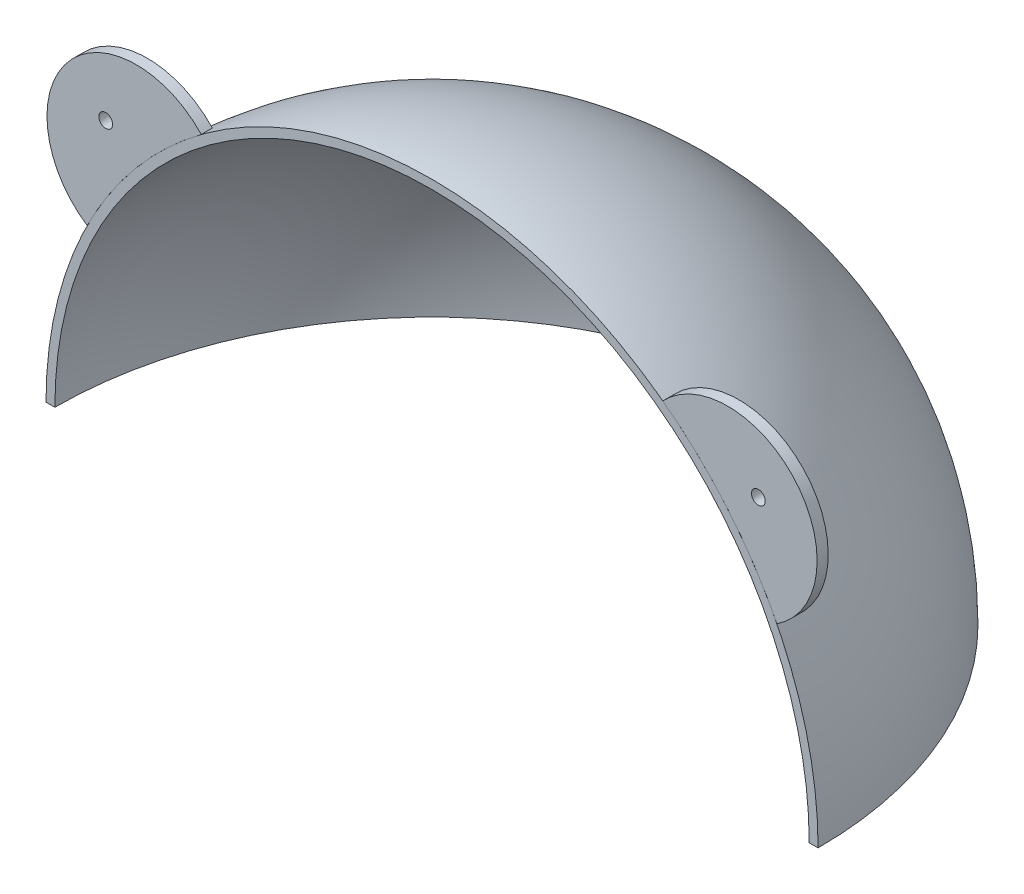
ISO-10303-21;
HEADER;
FILE_DESCRIPTION(('STEP AP214'),'2;1');
FILE_NAME('part.step','',(''),(''),'','','');
FILE_SCHEMA(('AUTOMOTIVE_DESIGN { 1 0 10303 214 1 1 1 1 }'));
ENDSEC;
DATA;
#1=APPLICATION_CONTEXT('core data for automotive mechanical design processes');
#2=APPLICATION_PROTOCOL_DEFINITION('international standard','automotive_design',2000,#1);
#3=PRODUCT_CONTEXT('',#1,'mechanical');
#4=PRODUCT('Part','Part','',(#3));
#5=PRODUCT_RELATED_PRODUCT_CATEGORY('part','',(#4));
#6=PRODUCT_DEFINITION_FORMATION('','',#4);
#7=PRODUCT_DEFINITION_CONTEXT('part definition',#1,'design');
#8=PRODUCT_DEFINITION('design','',#6,#7);
#9=PRODUCT_DEFINITION_SHAPE('','',#8);
#10=(LENGTH_UNIT() NAMED_UNIT(*) SI_UNIT(.MILLI.,.METRE.));
#11=(NAMED_UNIT(*) PLANE_ANGLE_UNIT() SI_UNIT($,.RADIAN.));
#12=(NAMED_UNIT(*) SI_UNIT($,.STERADIAN.) SOLID_ANGLE_UNIT());
#13=UNCERTAINTY_MEASURE_WITH_UNIT(LENGTH_MEASURE(1.E-05),#10,'distance_accuracy_value','');
#14=(GEOMETRIC_REPRESENTATION_CONTEXT(3) GLOBAL_UNCERTAINTY_ASSIGNED_CONTEXT((#13)) GLOBAL_UNIT_ASSIGNED_CONTEXT((#10,
#11,#12)) REPRESENTATION_CONTEXT('',''));
#15=CARTESIAN_POINT('',(0.,0.,0.));
#16=DIRECTION('',(0.,0.,1.));
#17=DIRECTION('',(1.,0.,0.));
#18=AXIS2_PLACEMENT_3D('',#15,#16,#17);
#19=CARTESIAN_POINT('',(-66.6458665513512,235.922522042729,-2.5));
#20=DIRECTION('',(0.,0.,1.));
#21=DIRECTION('',(1.,0.,0.));
#22=AXIS2_PLACEMENT_3D('',#19,#20,#21);
#23=CYLINDRICAL_SURFACE('',#22,20.1352711657527);
#24=CARTESIAN_POINT('',(-66.6458665513512,235.922522042729,0.));
#25=DIRECTION('',(0.,0.,1.));
#26=DIRECTION('',(1.,0.,0.));
#27=AXIS2_PLACEMENT_3D('',#24,#25,#26);
#28=CIRCLE('',#27,20.1352711657527);
#29=CARTESIAN_POINT('',(-52.0051905441537,249.745681991549,0.));
#30=VERTEX_POINT('',#29);
#31=CARTESIAN_POINT('',(-77.7166949316152,219.10390426679,0.));
#32=VERTEX_POINT('',#31);
#33=EDGE_CURVE('E68',#30,#32,#28,.T.);
#34=ORIENTED_EDGE('',*,*,#33,.F.);
#35=DIRECTION('',(0.,0.,1.));
#36=VECTOR('',#35,1.);
#37=CARTESIAN_POINT('',(-52.0051905441537,249.745681991549,-2.5));
#38=LINE('',#37,#36);
#39=CARTESIAN_POINT('',(-52.0051905441537,249.745681991549,-2.5));
#40=VERTEX_POINT('',#39);
#41=EDGE_CURVE('E12',#40,#30,#38,.T.);
#42=ORIENTED_EDGE('',*,*,#41,.F.);
#43=CARTESIAN_POINT('',(-66.6458665513512,235.922522042729,-2.5));
#44=DIRECTION('',(0.,0.,1.));
#45=DIRECTION('',(1.,0.,0.));
#46=AXIS2_PLACEMENT_3D('',#43,#44,#45);
#47=CIRCLE('',#46,20.1352711657527);
#48=CARTESIAN_POINT('',(-77.7166949316152,219.10390426679,-2.5));
#49=VERTEX_POINT('',#48);
#50=EDGE_CURVE('E75',#49,#40,#47,.F.);
#51=ORIENTED_EDGE('',*,*,#50,.F.);
#52=DIRECTION('',(0.,0.,1.));
#53=VECTOR('',#52,1.);
#54=CARTESIAN_POINT('',(-77.7166949316152,219.10390426679,-2.5));
#55=LINE('',#54,#53);
#56=EDGE_CURVE('E61',#49,#32,#55,.T.);
#57=ORIENTED_EDGE('',*,*,#56,.T.);
#58=EDGE_LOOP('',(#34,#42,#51,#57));
#59=FACE_BOUND('',#58,.T.);
#60=ADVANCED_FACE('F53',(#59),#23,.T.);
#61=CARTESIAN_POINT('',(0.,180.,-2.5));
#62=DIRECTION('',(0.,0.,1.));
#63=DIRECTION('',(1.,0.,0.));
#64=AXIS2_PLACEMENT_3D('',#61,#62,#63);
#65=CYLINDRICAL_SURFACE('',#64,87.);
#66=ORIENTED_EDGE('',*,*,#41,.T.);
#67=CARTESIAN_POINT('',(0.,180.,0.));
#68=DIRECTION('',(0.,0.,1.));
#69=DIRECTION('',(1.,0.,0.));
#70=AXIS2_PLACEMENT_3D('',#67,#68,#69);
#71=CIRCLE('',#70,87.);
#72=EDGE_CURVE('E81',#30,#32,#71,.T.);
#73=ORIENTED_EDGE('',*,*,#72,.T.);
#74=ORIENTED_EDGE('',*,*,#56,.F.);
#75=CARTESIAN_POINT('',(0.,180.,-2.5));
#76=DIRECTION('',(0.,0.,1.));
#77=DIRECTION('',(1.,0.,0.));
#78=AXIS2_PLACEMENT_3D('',#75,#76,#77);
#79=CIRCLE('',#78,87.);
#80=EDGE_CURVE('E90',#49,#40,#79,.F.);
#81=ORIENTED_EDGE('',*,*,#80,.T.);
#82=EDGE_LOOP('',(#66,#73,#74,#81));
#83=FACE_BOUND('',#82,.T.);
#84=ADVANCED_FACE('F89',(#83),#65,.F.);
#85=CARTESIAN_POINT('',(-73.540266539422,241.707610529908,-2.5));
#86=DIRECTION('',(0.,0.,1.));
#87=DIRECTION('',(1.,0.,0.));
#88=AXIS2_PLACEMENT_3D('',#85,#86,#87);
#89=CYLINDRICAL_SURFACE('',#88,1.54999999999999);
#90=CARTESIAN_POINT('',(-73.540266539422,241.707610529908,-2.5));
#91=DIRECTION('',(0.,0.,1.));
#92=DIRECTION('',(1.,0.,0.));
#93=AXIS2_PLACEMENT_3D('',#90,#91,#92);
#94=CIRCLE('',#93,1.54999999999999);
#95=CARTESIAN_POINT('',(-71.990266539422,241.707610529908,-2.5));
#96=VERTEX_POINT('',#95);
#97=EDGE_CURVE('E91',#96,#96,#94,.F.);
#98=ORIENTED_EDGE('',*,*,#97,.T.);
#99=EDGE_LOOP('',(#98));
#100=FACE_BOUND('',#99,.T.);
#101=CARTESIAN_POINT('',(-73.540266539422,241.707610529908,0.));
#102=DIRECTION('',(0.,0.,1.));
#103=DIRECTION('',(1.,0.,0.));
#104=AXIS2_PLACEMENT_3D('',#101,#102,#103);
#105=CIRCLE('',#104,1.54999999999999);
#106=CARTESIAN_POINT('',(-71.990266539422,241.707610529908,0.));
#107=VERTEX_POINT('',#106);
#108=EDGE_CURVE('E56',#107,#107,#105,.T.);
#109=ORIENTED_EDGE('',*,*,#108,.T.);
#110=EDGE_LOOP('',(#109));
#111=FACE_BOUND('',#110,.T.);
#112=ADVANCED_FACE('F98',(#100,#111),#89,.F.);
#113=CARTESIAN_POINT('',(0.,0.,-2.5));
#114=DIRECTION('',(0.,0.,1.));
#115=DIRECTION('',(1.,0.,0.));
#116=AXIS2_PLACEMENT_3D('',#113,#114,#115);
#117=PLANE('',#116);
#118=ORIENTED_EDGE('',*,*,#50,.T.);
#119=ORIENTED_EDGE('',*,*,#80,.F.);
#120=EDGE_LOOP('',(#118,#119));
#121=FACE_BOUND('',#120,.T.);
#122=ORIENTED_EDGE('',*,*,#97,.F.);
#123=EDGE_LOOP('',(#122));
#124=FACE_BOUND('',#123,.T.);
#125=ADVANCED_FACE('F101',(#121,#124),#117,.F.);
#126=CARTESIAN_POINT('',(0.,0.,0.));
#127=DIRECTION('',(0.,0.,1.));
#128=DIRECTION('',(1.,0.,0.));
#129=AXIS2_PLACEMENT_3D('',#126,#127,#128);
#130=PLANE('',#129);
#131=ORIENTED_EDGE('',*,*,#108,.F.);
#132=EDGE_LOOP('',(#131));
#133=FACE_BOUND('',#132,.T.);
#134=ORIENTED_EDGE('',*,*,#33,.T.);
#135=ORIENTED_EDGE('',*,*,#72,.F.);
#136=EDGE_LOOP('',(#134,#135));
#137=FACE_BOUND('',#136,.T.);
#138=ADVANCED_FACE('F82',(#133,#137),#130,.T.);
#139=CLOSED_SHELL('',(#60,#84,#112,#125,#138));
#140=MANIFOLD_SOLID_BREP('B2',#139);
#141=CARTESIAN_POINT('',(0.,180.,-2.5));
#142=DIRECTION('',(0.,0.,1.));
#143=DIRECTION('',(1.,0.,0.));
#144=AXIS2_PLACEMENT_3D('',#141,#142,#143);
#145=CYLINDRICAL_SURFACE('',#144,87.);
#146=CARTESIAN_POINT('',(0.,180.,0.));
#147=DIRECTION('',(0.,0.,1.));
#148=DIRECTION('',(1.,0.,0.));
#149=AXIS2_PLACEMENT_3D('',#146,#147,#148);
#150=CIRCLE('',#149,87.);
#151=CARTESIAN_POINT('',(52.0051905441537,249.745681991549,0.));
#152=VERTEX_POINT('',#151);
#153=CARTESIAN_POINT('',(77.7166949316152,219.10390426679,0.));
#154=VERTEX_POINT('',#153);
#155=EDGE_CURVE('E168',#152,#154,#150,.F.);
#156=ORIENTED_EDGE('',*,*,#155,.F.);
#157=DIRECTION('',(0.,0.,1.));
#158=VECTOR('',#157,1.);
#159=CARTESIAN_POINT('',(52.0051905441537,249.745681991549,-2.5));
#160=LINE('',#159,#158);
#161=CARTESIAN_POINT('',(52.0051905441537,249.745681991549,-2.5));
#162=VERTEX_POINT('',#161);
#163=EDGE_CURVE('E162',#162,#152,#160,.T.);
#164=ORIENTED_EDGE('',*,*,#163,.F.);
#165=CARTESIAN_POINT('',(0.,180.,-2.5));
#166=DIRECTION('',(0.,0.,1.));
#167=DIRECTION('',(1.,0.,0.));
#168=AXIS2_PLACEMENT_3D('',#165,#166,#167);
#169=CIRCLE('',#168,87.);
#170=CARTESIAN_POINT('',(77.7166949316152,219.10390426679,-2.5));
#171=VERTEX_POINT('',#170);
#172=EDGE_CURVE('E174',#171,#162,#169,.T.);
#173=ORIENTED_EDGE('',*,*,#172,.F.);
#174=DIRECTION('',(0.,0.,1.));
#175=VECTOR('',#174,1.);
#176=CARTESIAN_POINT('',(77.7166949316152,219.10390426679,-2.5));
#177=LINE('',#176,#175);
#178=EDGE_CURVE('E187',#171,#154,#177,.T.);
#179=ORIENTED_EDGE('',*,*,#178,.T.);
#180=EDGE_LOOP('',(#156,#164,#173,#179));
#181=FACE_BOUND('',#180,.T.);
#182=ADVANCED_FACE('F154',(#181),#145,.F.);
#183=CARTESIAN_POINT('',(73.540266539422,241.707610529908,-2.5));
#184=DIRECTION('',(0.,0.,1.));
#185=DIRECTION('',(1.,0.,0.));
#186=AXIS2_PLACEMENT_3D('',#183,#184,#185);
#187=CYLINDRICAL_SURFACE('',#186,1.54999999999999);
#188=CARTESIAN_POINT('',(73.540266539422,241.707610529908,-2.5));
#189=DIRECTION('',(0.,0.,1.));
#190=DIRECTION('',(1.,0.,0.));
#191=AXIS2_PLACEMENT_3D('',#188,#189,#190);
#192=CIRCLE('',#191,1.54999999999999);
#193=CARTESIAN_POINT('',(75.090266539422,241.707610529908,-2.5));
#194=VERTEX_POINT('',#193);
#195=EDGE_CURVE('E196',#194,#194,#192,.T.);
#196=ORIENTED_EDGE('',*,*,#195,.F.);
#197=EDGE_LOOP('',(#196));
#198=FACE_BOUND('',#197,.T.);
#199=CARTESIAN_POINT('',(73.540266539422,241.707610529908,0.));
#200=DIRECTION('',(0.,0.,1.));
#201=DIRECTION('',(1.,0.,0.));
#202=AXIS2_PLACEMENT_3D('',#199,#200,#201);
#203=CIRCLE('',#202,1.54999999999999);
#204=CARTESIAN_POINT('',(75.090266539422,241.707610529908,0.));
#205=VERTEX_POINT('',#204);
#206=EDGE_CURVE('E188',#205,#205,#203,.F.);
#207=ORIENTED_EDGE('',*,*,#206,.F.);
#208=EDGE_LOOP('',(#207));
#209=FACE_BOUND('',#208,.T.);
#210=ADVANCED_FACE('F156',(#198,#209),#187,.F.);
#211=CARTESIAN_POINT('',(66.6458665513512,235.922522042729,-2.5));
#212=DIRECTION('',(0.,0.,1.));
#213=DIRECTION('',(1.,0.,0.));
#214=AXIS2_PLACEMENT_3D('',#211,#212,#213);
#215=CYLINDRICAL_SURFACE('',#214,20.1352711657527);
#216=ORIENTED_EDGE('',*,*,#163,.T.);
#217=CARTESIAN_POINT('',(66.6458665513512,235.922522042729,0.));
#218=DIRECTION('',(0.,0.,1.));
#219=DIRECTION('',(1.,0.,0.));
#220=AXIS2_PLACEMENT_3D('',#217,#218,#219);
#221=CIRCLE('',#220,20.1352711657527);
#222=EDGE_CURVE('E51',#152,#154,#221,.F.);
#223=ORIENTED_EDGE('',*,*,#222,.T.);
#224=ORIENTED_EDGE('',*,*,#178,.F.);
#225=CARTESIAN_POINT('',(66.6458665513512,235.922522042729,-2.5));
#226=DIRECTION('',(0.,0.,1.));
#227=DIRECTION('',(1.,0.,0.));
#228=AXIS2_PLACEMENT_3D('',#225,#226,#227);
#229=CIRCLE('',#228,20.1352711657527);
#230=EDGE_CURVE('E191',#171,#162,#229,.T.);
#231=ORIENTED_EDGE('',*,*,#230,.T.);
#232=EDGE_LOOP('',(#216,#223,#224,#231));
#233=FACE_BOUND('',#232,.T.);
#234=ADVANCED_FACE('F190',(#233),#215,.T.);
#235=CARTESIAN_POINT('',(0.,0.,-2.5));
#236=DIRECTION('',(0.,0.,1.));
#237=DIRECTION('',(1.,0.,0.));
#238=AXIS2_PLACEMENT_3D('',#235,#236,#237);
#239=PLANE('',#238);
#240=ORIENTED_EDGE('',*,*,#195,.T.);
#241=EDGE_LOOP('',(#240));
#242=FACE_BOUND('',#241,.T.);
#243=ORIENTED_EDGE('',*,*,#172,.T.);
#244=ORIENTED_EDGE('',*,*,#230,.F.);
#245=EDGE_LOOP('',(#243,#244));
#246=FACE_BOUND('',#245,.T.);
#247=ADVANCED_FACE('F208',(#242,#246),#239,.F.);
#248=CARTESIAN_POINT('',(0.,0.,0.));
#249=DIRECTION('',(0.,0.,1.));
#250=DIRECTION('',(1.,0.,0.));
#251=AXIS2_PLACEMENT_3D('',#248,#249,#250);
#252=PLANE('',#251);
#253=ORIENTED_EDGE('',*,*,#155,.T.);
#254=ORIENTED_EDGE('',*,*,#222,.F.);
#255=EDGE_LOOP('',(#253,#254));
#256=FACE_BOUND('',#255,.T.);
#257=ORIENTED_EDGE('',*,*,#206,.T.);
#258=EDGE_LOOP('',(#257));
#259=FACE_BOUND('',#258,.T.);
#260=ADVANCED_FACE('F180',(#256,#259),#252,.T.);
#261=CLOSED_SHELL('',(#182,#210,#234,#247,#260));
#262=MANIFOLD_SOLID_BREP('B6',#261);
#263=CARTESIAN_POINT('',(0.,177.5,-89.));
#264=DIRECTION('',(0.,1.,0.));
#265=DIRECTION('',(0.,0.,1.));
#266=AXIS2_PLACEMENT_3D('',#263,#264,#265);
#267=CYLINDRICAL_SURFACE('',#266,5.);
#268=CARTESIAN_POINT('',(0.,180.,-89.));
#269=DIRECTION('',(0.,1.,0.));
#270=DIRECTION('',(0.,0.,1.));
#271=AXIS2_PLACEMENT_3D('',#268,#269,#270);
#272=CIRCLE('',#271,5.);
#273=CARTESIAN_POINT('',(0.,180.,-94.));
#274=VERTEX_POINT('',#273);
#275=CARTESIAN_POINT('',(5.,180.,-89.));
#276=VERTEX_POINT('',#275);
#277=EDGE_CURVE('E329',#274,#276,#272,.F.);
#278=ORIENTED_EDGE('',*,*,#277,.F.);
#279=DIRECTION('',(0.,1.,0.));
#280=VECTOR('',#279,1.);
#281=CARTESIAN_POINT('',(0.,177.5,-94.));
#282=LINE('',#281,#280);
#283=CARTESIAN_POINT('',(0.,182.5,-94.));
#284=VERTEX_POINT('',#283);
#285=EDGE_CURVE('E326',#284,#274,#282,.F.);
#286=ORIENTED_EDGE('',*,*,#285,.F.);
#287=CARTESIAN_POINT('',(0.,182.5,-89.));
#288=DIRECTION('',(0.,1.,0.));
#289=DIRECTION('',(0.,0.,1.));
#290=AXIS2_PLACEMENT_3D('',#287,#288,#289);
#291=CIRCLE('',#290,5.);
#292=CARTESIAN_POINT('',(5.,182.5,-89.));
#293=VERTEX_POINT('',#292);
#294=EDGE_CURVE('E355',#293,#284,#291,.T.);
#295=ORIENTED_EDGE('',*,*,#294,.F.);
#296=DIRECTION('',(0.,1.,0.));
#297=VECTOR('',#296,1.);
#298=CARTESIAN_POINT('',(5.,177.5,-89.));
#299=LINE('',#298,#297);
#300=EDGE_CURVE('E257',#276,#293,#299,.T.);
#301=ORIENTED_EDGE('',*,*,#300,.F.);
#302=EDGE_LOOP('',(#278,#286,#295,#301));
#303=FACE_BOUND('',#302,.T.);
#304=ADVANCED_FACE('F249',(#303),#267,.T.);
#305=CARTESIAN_POINT('',(0.,177.5,-89.));
#306=DIRECTION('',(0.,1.,0.));
#307=DIRECTION('',(0.,0.,1.));
#308=AXIS2_PLACEMENT_3D('',#305,#306,#307);
#309=CYLINDRICAL_SURFACE('',#308,5.);
#310=CARTESIAN_POINT('',(0.,180.,-89.));
#311=DIRECTION('',(0.,1.,0.));
#312=DIRECTION('',(0.,0.,1.));
#313=AXIS2_PLACEMENT_3D('',#310,#311,#312);
#314=CIRCLE('',#313,5.);
#315=CARTESIAN_POINT('',(-5.,180.,-89.));
#316=VERTEX_POINT('',#315);
#317=EDGE_CURVE('E372',#316,#274,#314,.F.);
#318=ORIENTED_EDGE('',*,*,#317,.F.);
#319=DIRECTION('',(0.,1.,0.));
#320=VECTOR('',#319,1.);
#321=CARTESIAN_POINT('',(-5.,177.5,-89.));
#322=LINE('',#321,#320);
#323=CARTESIAN_POINT('',(-5.,182.5,-89.));
#324=VERTEX_POINT('',#323);
#325=EDGE_CURVE('E360',#324,#316,#322,.F.);
#326=ORIENTED_EDGE('',*,*,#325,.F.);
#327=CARTESIAN_POINT('',(0.,182.5,-89.));
#328=DIRECTION('',(0.,1.,0.));
#329=DIRECTION('',(0.,0.,1.));
#330=AXIS2_PLACEMENT_3D('',#327,#328,#329);
#331=CIRCLE('',#330,5.);
#332=EDGE_CURVE('E271',#284,#324,#331,.T.);
#333=ORIENTED_EDGE('',*,*,#332,.F.);
#334=ORIENTED_EDGE('',*,*,#285,.T.);
#335=EDGE_LOOP('',(#318,#326,#333,#334));
#336=FACE_BOUND('',#335,.T.);
#337=ADVANCED_FACE('F370',(#336),#309,.T.);
#338=CARTESIAN_POINT('',(0.,177.5,-90.5));
#339=DIRECTION('',(0.,1.,0.));
#340=DIRECTION('',(0.,0.,1.));
#341=AXIS2_PLACEMENT_3D('',#338,#339,#340);
#342=CYLINDRICAL_SURFACE('',#341,1.54999999999999);
#343=CARTESIAN_POINT('',(0.,180.,-90.5));
#344=DIRECTION('',(0.,1.,0.));
#345=DIRECTION('',(0.,0.,1.));
#346=AXIS2_PLACEMENT_3D('',#343,#344,#345);
#347=CIRCLE('',#346,1.54999999999999);
#348=CARTESIAN_POINT('',(0.,180.,-88.95));
#349=VERTEX_POINT('',#348);
#350=EDGE_CURVE('E322',#349,#349,#347,.F.);
#351=ORIENTED_EDGE('',*,*,#350,.T.);
#352=EDGE_LOOP('',(#351));
#353=FACE_BOUND('',#352,.T.);
#354=CARTESIAN_POINT('',(0.,182.5,-90.5));
#355=DIRECTION('',(0.,1.,0.));
#356=DIRECTION('',(0.,0.,1.));
#357=AXIS2_PLACEMENT_3D('',#354,#355,#356);
#358=CIRCLE('',#357,1.54999999999999);
#359=CARTESIAN_POINT('',(0.,182.5,-88.95));
#360=VERTEX_POINT('',#359);
#361=EDGE_CURVE('E333',#360,#360,#358,.T.);
#362=ORIENTED_EDGE('',*,*,#361,.T.);
#363=EDGE_LOOP('',(#362));
#364=FACE_BOUND('',#363,.T.);
#365=ADVANCED_FACE('F408',(#353,#364),#342,.F.);
#366=CARTESIAN_POINT('',(-5.,177.5,-94.));
#367=DIRECTION('',(-1.,0.,0.));
#368=DIRECTION('',(0.,0.,1.));
#369=AXIS2_PLACEMENT_3D('',#366,#367,#368);
#370=PLANE('',#369);
#371=DIRECTION('',(0.,0.,-1.));
#372=VECTOR('',#371,1.);
#373=CARTESIAN_POINT('',(-5.,180.,-94.));
#374=LINE('',#373,#372);
#375=CARTESIAN_POINT('',(-5.,180.,-86.8562030024339));
#376=VERTEX_POINT('',#375);
#377=EDGE_CURVE('E380',#376,#316,#374,.T.);
#378=ORIENTED_EDGE('',*,*,#377,.F.);
#379=CARTESIAN_POINT('',(-5.,180.,0.));
#380=DIRECTION('',(-1.,0.,0.));
#381=DIRECTION('',(0.,0.,1.));
#382=AXIS2_PLACEMENT_3D('',#379,#380,#381);
#383=CIRCLE('',#382,86.8562030024339);
#384=CARTESIAN_POINT('',(-5.,182.5,-86.8202165396978));
#385=VERTEX_POINT('',#384);
#386=EDGE_CURVE('E351',#385,#376,#383,.T.);
#387=ORIENTED_EDGE('',*,*,#386,.F.);
#388=DIRECTION('',(0.,0.,1.));
#389=VECTOR('',#388,1.);
#390=CARTESIAN_POINT('',(-5.,182.5,-94.));
#391=LINE('',#390,#389);
#392=EDGE_CURVE('E337',#324,#385,#391,.T.);
#393=ORIENTED_EDGE('',*,*,#392,.F.);
#394=ORIENTED_EDGE('',*,*,#325,.T.);
#395=EDGE_LOOP('',(#378,#387,#393,#394));
#396=FACE_BOUND('',#395,.T.);
#397=ADVANCED_FACE('F406',(#396),#370,.T.);
#398=CARTESIAN_POINT('',(0.,182.5,0.));
#399=DIRECTION('',(0.,1.,0.));
#400=DIRECTION('',(0.,0.,1.));
#401=AXIS2_PLACEMENT_3D('',#398,#399,#400);
#402=PLANE('',#401);
#403=ORIENTED_EDGE('',*,*,#294,.T.);
#404=ORIENTED_EDGE('',*,*,#332,.T.);
#405=ORIENTED_EDGE('',*,*,#392,.T.);
#406=CARTESIAN_POINT('',(0.,182.5,0.));
#407=DIRECTION('',(0.,1.,0.));
#408=DIRECTION('',(0.,0.,1.));
#409=AXIS2_PLACEMENT_3D('',#406,#407,#408);
#410=CIRCLE('',#409,86.9640730416878);
#411=CARTESIAN_POINT('',(5.,182.5,-86.8202165396978));
#412=VERTEX_POINT('',#411);
#413=EDGE_CURVE('E344',#412,#385,#410,.T.);
#414=ORIENTED_EDGE('',*,*,#413,.F.);
#415=DIRECTION('',(0.,0.,-1.));
#416=VECTOR('',#415,1.);
#417=CARTESIAN_POINT('',(5.,182.5,-94.));
#418=LINE('',#417,#416);
#419=EDGE_CURVE('E340',#412,#293,#418,.T.);
#420=ORIENTED_EDGE('',*,*,#419,.T.);
#421=EDGE_LOOP('',(#403,#404,#405,#414,#420));
#422=FACE_BOUND('',#421,.T.);
#423=ORIENTED_EDGE('',*,*,#361,.F.);
#424=EDGE_LOOP('',(#423));
#425=FACE_BOUND('',#424,.T.);
#426=ADVANCED_FACE('F401',(#422,#425),#402,.T.);
#427=CARTESIAN_POINT('',(5.,177.5,-94.));
#428=DIRECTION('',(1.,0.,0.));
#429=DIRECTION('',(0.,0.,-1.));
#430=AXIS2_PLACEMENT_3D('',#427,#428,#429);
#431=PLANE('',#430);
#432=DIRECTION('',(0.,0.,1.));
#433=VECTOR('',#432,1.);
#434=CARTESIAN_POINT('',(5.,180.,-94.));
#435=LINE('',#434,#433);
#436=CARTESIAN_POINT('',(5.,180.,-86.8562030024339));
#437=VERTEX_POINT('',#436);
#438=EDGE_CURVE('E385',#276,#437,#435,.T.);
#439=ORIENTED_EDGE('',*,*,#438,.F.);
#440=ORIENTED_EDGE('',*,*,#300,.T.);
#441=ORIENTED_EDGE('',*,*,#419,.F.);
#442=CARTESIAN_POINT('',(5.00000000000001,180.,0.));
#443=DIRECTION('',(1.,0.,0.));
#444=DIRECTION('',(0.,0.,-1.));
#445=AXIS2_PLACEMENT_3D('',#442,#443,#444);
#446=CIRCLE('',#445,86.8562030024339);
#447=EDGE_CURVE('E348',#437,#412,#446,.T.);
#448=ORIENTED_EDGE('',*,*,#447,.F.);
#449=EDGE_LOOP('',(#439,#440,#441,#448));
#450=FACE_BOUND('',#449,.T.);
#451=ADVANCED_FACE('F400',(#450),#431,.T.);
#452=CARTESIAN_POINT('',(0.,180.,0.));
#453=DIRECTION('',(0.,1.,0.));
#454=DIRECTION('',(0.,0.,-1.));
#455=AXIS2_PLACEMENT_3D('',#452,#453,#454);
#456=SPHERICAL_SURFACE('',#455,87.);
#457=CARTESIAN_POINT('',(0.,180.,0.));
#458=DIRECTION('',(0.,0.,1.));
#459=DIRECTION('',(1.,0.,0.));
#460=AXIS2_PLACEMENT_3D('',#457,#458,#459);
#461=CIRCLE('',#460,87.);
#462=CARTESIAN_POINT('',(87.,180.,0.));
#463=VERTEX_POINT('',#462);
#464=CARTESIAN_POINT('',(-87.,180.,0.));
#465=VERTEX_POINT('',#464);
#466=EDGE_CURVE('E317',#463,#465,#461,.T.);
#467=ORIENTED_EDGE('',*,*,#466,.F.);
#468=CARTESIAN_POINT('',(0.,180.,0.));
#469=DIRECTION('',(0.,1.,0.));
#470=DIRECTION('',(0.,0.,1.));
#471=AXIS2_PLACEMENT_3D('',#468,#469,#470);
#472=CIRCLE('',#471,87.);
#473=EDGE_CURVE('E388',#463,#437,#472,.T.);
#474=ORIENTED_EDGE('',*,*,#473,.T.);
#475=ORIENTED_EDGE('',*,*,#447,.T.);
#476=ORIENTED_EDGE('',*,*,#413,.T.);
#477=ORIENTED_EDGE('',*,*,#386,.T.);
#478=EDGE_CURVE('E389',#376,#465,#472,.T.);
#479=ORIENTED_EDGE('',*,*,#478,.T.);
#480=EDGE_LOOP('',(#467,#474,#475,#476,#477,#479));
#481=FACE_BOUND('',#480,.T.);
#482=ADVANCED_FACE('F396',(#481),#456,.T.);
#483=CARTESIAN_POINT('',(0.,0.,0.));
#484=DIRECTION('',(0.,0.,1.));
#485=DIRECTION('',(1.,0.,0.));
#486=AXIS2_PLACEMENT_3D('',#483,#484,#485);
#487=PLANE('',#486);
#488=DIRECTION('',(-1.,0.,0.));
#489=VECTOR('',#488,1.);
#490=CARTESIAN_POINT('',(0.,180.,0.));
#491=LINE('',#490,#489);
#492=CARTESIAN_POINT('',(85.,180.,0.));
#493=VERTEX_POINT('',#492);
#494=EDGE_CURVE('E264',#463,#493,#491,.T.);
#495=ORIENTED_EDGE('',*,*,#494,.F.);
#496=ORIENTED_EDGE('',*,*,#466,.T.);
#497=CARTESIAN_POINT('',(-85.,180.,0.));
#498=VERTEX_POINT('',#497);
#499=EDGE_CURVE('E307',#498,#465,#491,.T.);
#500=ORIENTED_EDGE('',*,*,#499,.F.);
#501=CARTESIAN_POINT('',(0.,180.,0.));
#502=DIRECTION('',(0.,0.,1.));
#503=DIRECTION('',(1.,0.,0.));
#504=AXIS2_PLACEMENT_3D('',#501,#502,#503);
#505=CIRCLE('',#504,85.);
#506=EDGE_CURVE('E315',#498,#493,#505,.F.);
#507=ORIENTED_EDGE('',*,*,#506,.T.);
#508=EDGE_LOOP('',(#495,#496,#500,#507));
#509=FACE_BOUND('',#508,.T.);
#510=ADVANCED_FACE('F314',(#509),#487,.T.);
#511=CARTESIAN_POINT('',(0.,180.,0.));
#512=DIRECTION('',(0.,1.,0.));
#513=DIRECTION('',(0.,0.,-1.));
#514=AXIS2_PLACEMENT_3D('',#511,#512,#513);
#515=SPHERICAL_SURFACE('',#514,85.);
#516=ORIENTED_EDGE('',*,*,#506,.F.);
#517=CARTESIAN_POINT('',(0.,180.,0.));
#518=DIRECTION('',(0.,1.,0.));
#519=DIRECTION('',(0.,0.,1.));
#520=AXIS2_PLACEMENT_3D('',#517,#518,#519);
#521=CIRCLE('',#520,85.);
#522=EDGE_CURVE('E152',#498,#493,#521,.F.);
#523=ORIENTED_EDGE('',*,*,#522,.T.);
#524=EDGE_LOOP('',(#516,#523));
#525=FACE_BOUND('',#524,.T.);
#526=ADVANCED_FACE('F320',(#525),#515,.F.);
#527=CARTESIAN_POINT('',(0.,180.,0.));
#528=DIRECTION('',(0.,1.,0.));
#529=DIRECTION('',(0.,0.,1.));
#530=AXIS2_PLACEMENT_3D('',#527,#528,#529);
#531=PLANE('',#530);
#532=ORIENTED_EDGE('',*,*,#277,.T.);
#533=ORIENTED_EDGE('',*,*,#438,.T.);
#534=ORIENTED_EDGE('',*,*,#473,.F.);
#535=ORIENTED_EDGE('',*,*,#494,.T.);
#536=ORIENTED_EDGE('',*,*,#522,.F.);
#537=ORIENTED_EDGE('',*,*,#499,.T.);
#538=ORIENTED_EDGE('',*,*,#478,.F.);
#539=ORIENTED_EDGE('',*,*,#377,.T.);
#540=ORIENTED_EDGE('',*,*,#317,.T.);
#541=EDGE_LOOP('',(#532,#533,#534,#535,#536,#537,#538,#539,#540));
#542=FACE_BOUND('',#541,.T.);
#543=ORIENTED_EDGE('',*,*,#350,.F.);
#544=EDGE_LOOP('',(#543));
#545=FACE_BOUND('',#544,.T.);
#546=ADVANCED_FACE('F305',(#542,#545),#531,.F.);
#547=CLOSED_SHELL('',(#304,#337,#365,#397,#426,#451,#482,#510,#526,#546));
#548=MANIFOLD_SOLID_BREP('B45',#547);
#549=ADVANCED_BREP_SHAPE_REPRESENTATION('',(#18,#140,#262,#548),#14);
#550=SHAPE_DEFINITION_REPRESENTATION(#9,#549);
ENDSEC;
END-ISO-10303-21;
